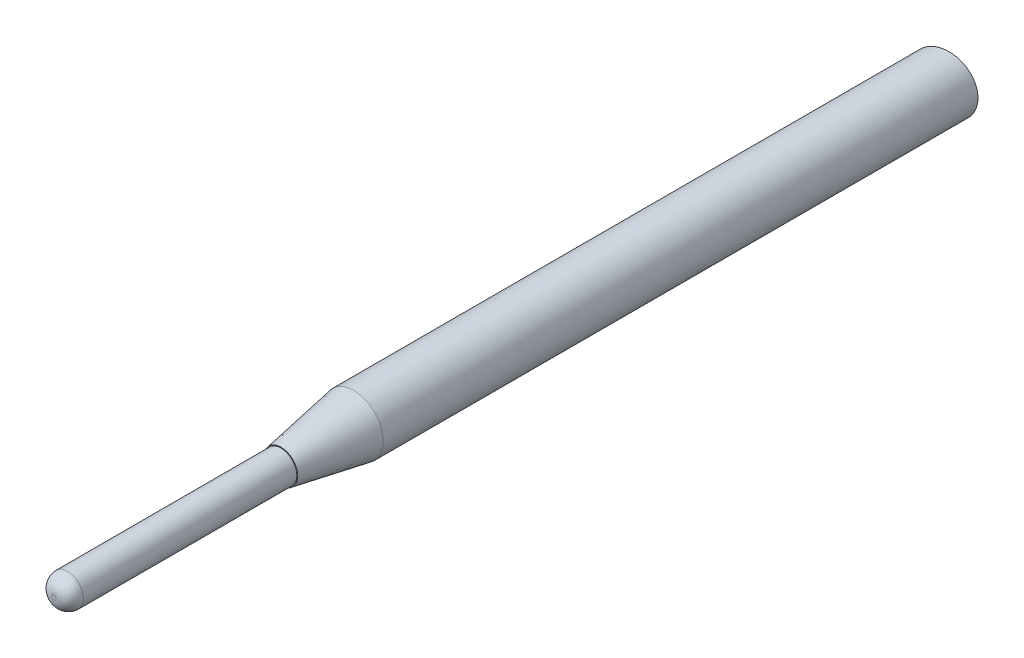
ISO-10303-21;
HEADER;
FILE_DESCRIPTION(('STEP AP214'),'2;1');
FILE_NAME('part.step','',(''),(''),'','','');
FILE_SCHEMA(('AUTOMOTIVE_DESIGN { 1 0 10303 214 1 1 1 1 }'));
ENDSEC;
DATA;
#1=APPLICATION_CONTEXT('core data for automotive mechanical design processes');
#2=APPLICATION_PROTOCOL_DEFINITION('international standard','automotive_design',2000,#1);
#3=PRODUCT_CONTEXT('',#1,'mechanical');
#4=PRODUCT('Part','Part','',(#3));
#5=PRODUCT_RELATED_PRODUCT_CATEGORY('part','',(#4));
#6=PRODUCT_DEFINITION_FORMATION('','',#4);
#7=PRODUCT_DEFINITION_CONTEXT('part definition',#1,'design');
#8=PRODUCT_DEFINITION('design','',#6,#7);
#9=PRODUCT_DEFINITION_SHAPE('','',#8);
#10=(LENGTH_UNIT() NAMED_UNIT(*) SI_UNIT(.MILLI.,.METRE.));
#11=(NAMED_UNIT(*) PLANE_ANGLE_UNIT() SI_UNIT($,.RADIAN.));
#12=(NAMED_UNIT(*) SI_UNIT($,.STERADIAN.) SOLID_ANGLE_UNIT());
#13=UNCERTAINTY_MEASURE_WITH_UNIT(LENGTH_MEASURE(1.E-05),#10,'distance_accuracy_value','');
#14=(GEOMETRIC_REPRESENTATION_CONTEXT(3) GLOBAL_UNCERTAINTY_ASSIGNED_CONTEXT((#13)) GLOBAL_UNIT_ASSIGNED_CONTEXT((#10,
#11,#12)) REPRESENTATION_CONTEXT('',''));
#15=CARTESIAN_POINT('',(0.,0.,0.));
#16=DIRECTION('',(0.,0.,1.));
#17=DIRECTION('',(1.,0.,0.));
#18=AXIS2_PLACEMENT_3D('',#15,#16,#17);
#19=CARTESIAN_POINT('',(0.,0.,147.));
#20=DIRECTION('',(0.,0.,-1.));
#21=DIRECTION('',(-1.,0.,0.));
#22=AXIS2_PLACEMENT_3D('',#19,#20,#21);
#23=CYLINDRICAL_SURFACE('',#22,6.5);
#24=CARTESIAN_POINT('',(0.,0.,131.));
#25=DIRECTION('',(0.,0.,1.));
#26=DIRECTION('',(1.,0.,0.));
#27=AXIS2_PLACEMENT_3D('',#24,#25,#26);
#28=CIRCLE('',#27,6.5);
#29=CARTESIAN_POINT('',(6.5,0.,131.));
#30=VERTEX_POINT('',#29);
#31=EDGE_CURVE('E11',#30,#30,#28,.F.);
#32=ORIENTED_EDGE('',*,*,#31,.T.);
#33=EDGE_LOOP('',(#32));
#34=FACE_BOUND('',#33,.T.);
#35=CARTESIAN_POINT('',(0.,0.,0.913515425565503));
#36=DIRECTION('',(0.139173100960059,0.,0.990268068741571));
#37=DIRECTION('',(0.990268068741571,0.,-0.139173100960059));
#38=AXIS2_PLACEMENT_3D('',#35,#36,#37);
#39=ELLIPSE('',#38,6.56387922137101,6.5);
#40=CARTESIAN_POINT('',(6.5,0.,0.));
#41=VERTEX_POINT('',#40);
#42=EDGE_CURVE('E68',#41,#41,#39,.T.);
#43=ORIENTED_EDGE('',*,*,#42,.T.);
#44=EDGE_LOOP('',(#43));
#45=FACE_BOUND('',#44,.T.);
#46=ADVANCED_FACE('F37',(#34,#45),#23,.T.);
#47=CARTESIAN_POINT('',(0.,0.,147.));
#48=DIRECTION('',(0.,0.,1.));
#49=DIRECTION('',(1.,0.,0.));
#50=AXIS2_PLACEMENT_3D('',#47,#48,#49);
#51=PLANE('',#50);
#52=CARTESIAN_POINT('',(0.,0.,147.));
#53=DIRECTION('',(0.,0.,1.));
#54=DIRECTION('',(1.,0.,0.));
#55=AXIS2_PLACEMENT_3D('',#52,#53,#54);
#56=CIRCLE('',#55,3.67876830866459);
#57=CARTESIAN_POINT('',(3.67876830866459,0.,147.));
#58=VERTEX_POINT('',#57);
#59=EDGE_CURVE('E45',#58,#58,#56,.T.);
#60=ORIENTED_EDGE('',*,*,#59,.T.);
#61=EDGE_LOOP('',(#60));
#62=FACE_BOUND('',#61,.T.);
#63=CARTESIAN_POINT('',(0.,0.,147.));
#64=DIRECTION('',(0.,0.,1.));
#65=DIRECTION('',(1.,0.,0.));
#66=AXIS2_PLACEMENT_3D('',#63,#64,#65);
#67=CIRCLE('',#66,3.5);
#68=CARTESIAN_POINT('',(3.5,0.,147.));
#69=VERTEX_POINT('',#68);
#70=EDGE_CURVE('E86',#69,#69,#67,.T.);
#71=ORIENTED_EDGE('',*,*,#70,.F.);
#72=EDGE_LOOP('',(#71));
#73=FACE_BOUND('',#72,.T.);
#74=ADVANCED_FACE('F97',(#62,#73),#51,.T.);
#75=CARTESIAN_POINT('',(0.,0.,197.));
#76=DIRECTION('',(0.,0.,-1.));
#77=DIRECTION('',(-1.,0.,0.));
#78=AXIS2_PLACEMENT_3D('',#75,#76,#77);
#79=CYLINDRICAL_SURFACE('',#78,3.5);
#80=CARTESIAN_POINT('',(0.,0.,194.));
#81=DIRECTION('',(0.,0.,1.));
#82=DIRECTION('',(1.,0.,0.));
#83=AXIS2_PLACEMENT_3D('',#80,#81,#82);
#84=CIRCLE('',#83,3.5);
#85=CARTESIAN_POINT('',(3.5,0.,194.));
#86=VERTEX_POINT('',#85);
#87=EDGE_CURVE('E92',#86,#86,#84,.F.);
#88=ORIENTED_EDGE('',*,*,#87,.T.);
#89=EDGE_LOOP('',(#88));
#90=FACE_BOUND('',#89,.T.);
#91=ORIENTED_EDGE('',*,*,#70,.T.);
#92=EDGE_LOOP('',(#91));
#93=FACE_BOUND('',#92,.T.);
#94=ADVANCED_FACE('F117',(#90,#93),#79,.T.);
#95=CARTESIAN_POINT('',(0.,0.,197.));
#96=DIRECTION('',(0.,0.,1.));
#97=DIRECTION('',(1.,0.,0.));
#98=AXIS2_PLACEMENT_3D('',#95,#96,#97);
#99=PLANE('',#98);
#100=CARTESIAN_POINT('',(0.,0.,197.));
#101=DIRECTION('',(0.,0.,1.));
#102=DIRECTION('',(1.,0.,0.));
#103=AXIS2_PLACEMENT_3D('',#100,#101,#102);
#104=CIRCLE('',#103,0.5);
#105=CARTESIAN_POINT('',(0.5,0.,197.));
#106=VERTEX_POINT('',#105);
#107=EDGE_CURVE('E89',#106,#106,#104,.T.);
#108=ORIENTED_EDGE('',*,*,#107,.T.);
#109=EDGE_LOOP('',(#108));
#110=FACE_BOUND('',#109,.T.);
#111=ADVANCED_FACE('F108',(#110),#99,.T.);
#112=CARTESIAN_POINT('',(0.,0.,194.));
#113=DIRECTION('',(0.,0.,1.));
#114=DIRECTION('',(1.,0.,0.));
#115=AXIS2_PLACEMENT_3D('',#112,#113,#114);
#116=DEGENERATE_TOROIDAL_SURFACE('',#115,0.5,3.,.T.);
#117=ORIENTED_EDGE('',*,*,#87,.F.);
#118=EDGE_LOOP('',(#117));
#119=FACE_BOUND('',#118,.T.);
#120=ORIENTED_EDGE('',*,*,#107,.F.);
#121=EDGE_LOOP('',(#120));
#122=FACE_BOUND('',#121,.T.);
#123=ADVANCED_FACE('F101',(#119,#122),#116,.T.);
#124=CARTESIAN_POINT('',(0.,0.,147.));
#125=DIRECTION('',(0.,0.,-1.));
#126=DIRECTION('',(-1.,0.,0.));
#127=AXIS2_PLACEMENT_3D('',#124,#125,#126);
#128=CONICAL_SURFACE('',#127,3.67876830866459,0.17453292519943);
#129=ORIENTED_EDGE('',*,*,#31,.F.);
#130=EDGE_LOOP('',(#129));
#131=FACE_BOUND('',#130,.T.);
#132=ORIENTED_EDGE('',*,*,#59,.F.);
#133=EDGE_LOOP('',(#132));
#134=FACE_BOUND('',#133,.T.);
#135=ADVANCED_FACE('F39',(#131,#134),#128,.T.);
#136=CARTESIAN_POINT('',(6.5,-6.5,0.));
#137=DIRECTION('',(0.139173100960059,0.,0.990268068741571));
#138=DIRECTION('',(0.990268068741571,0.,-0.139173100960059));
#139=AXIS2_PLACEMENT_3D('',#136,#137,#138);
#140=PLANE('',#139);
#141=DIRECTION('',(0.,-1.,0.));
#142=VECTOR('',#141,1.);
#143=CARTESIAN_POINT('',(1.71783744694811,1.18982242293795,0.6720891168884));
#144=LINE('',#143,#142);
#145=CARTESIAN_POINT('',(1.71783744694811,1.18982242293795,0.672089116888399));
#146=VERTEX_POINT('',#145);
#147=CARTESIAN_POINT('',(1.71783744694811,-1.18982242293795,0.6720891168884));
#148=VERTEX_POINT('',#147);
#149=EDGE_CURVE('E72',#146,#148,#144,.T.);
#150=ORIENTED_EDGE('',*,*,#149,.F.);
#151=CARTESIAN_POINT('',(0.125899488200451,0.,0.895821406405205));
#152=DIRECTION('',(-0.139173100960059,0.,-0.990268068741571));
#153=DIRECTION('',(-0.990268068741571,0.,0.139173100960059));
#154=AXIS2_PLACEMENT_3D('',#151,#152,#153);
#155=CIRCLE('',#154,2.);
#156=EDGE_CURVE('E52',#148,#146,#155,.T.);
#157=ORIENTED_EDGE('',*,*,#156,.F.);
#158=EDGE_LOOP('',(#150,#157));
#159=FACE_BOUND('',#158,.T.);
#160=ORIENTED_EDGE('',*,*,#42,.F.);
#161=EDGE_LOOP('',(#160));
#162=FACE_BOUND('',#161,.T.);
#163=ADVANCED_FACE('F76',(#159,#162),#140,.F.);
#164=CARTESIAN_POINT('',(0.821764993000745,0.,5.84716175011306));
#165=DIRECTION('',(-0.139173100960059,0.,-0.990268068741571));
#166=DIRECTION('',(-0.990268068741571,0.,0.139173100960059));
#167=AXIS2_PLACEMENT_3D('',#164,#165,#166);
#168=CYLINDRICAL_SURFACE('',#167,2.);
#169=ORIENTED_EDGE('',*,*,#156,.T.);
#170=DIRECTION('',(-0.139173100960059,0.,-0.990268068741571));
#171=VECTOR('',#170,1.);
#172=CARTESIAN_POINT('',(2.4137029517484,1.18982242293795,5.62342946059626));
#173=LINE('',#172,#171);
#174=CARTESIAN_POINT('',(2.4137029517484,1.18982242293795,5.62342946059626));
#175=VERTEX_POINT('',#174);
#176=EDGE_CURVE('E69',#175,#146,#173,.T.);
#177=ORIENTED_EDGE('',*,*,#176,.F.);
#178=CARTESIAN_POINT('',(0.821764993000745,0.,5.84716175011306));
#179=DIRECTION('',(-0.139173100960059,0.,-0.990268068741571));
#180=DIRECTION('',(-0.990268068741571,0.,0.139173100960059));
#181=AXIS2_PLACEMENT_3D('',#178,#179,#180);
#182=CIRCLE('',#181,2.);
#183=CARTESIAN_POINT('',(2.4137029517484,-1.18982242293795,5.62342946059626));
#184=VERTEX_POINT('',#183);
#185=EDGE_CURVE('E66',#184,#175,#182,.T.);
#186=ORIENTED_EDGE('',*,*,#185,.F.);
#187=DIRECTION('',(-0.139173100960059,0.,-0.990268068741571));
#188=VECTOR('',#187,1.);
#189=CARTESIAN_POINT('',(2.4137029517484,-1.18982242293795,5.62342946059626));
#190=LINE('',#189,#188);
#191=EDGE_CURVE('E60',#184,#148,#190,.T.);
#192=ORIENTED_EDGE('',*,*,#191,.T.);
#193=EDGE_LOOP('',(#169,#177,#186,#192));
#194=FACE_BOUND('',#193,.T.);
#195=ADVANCED_FACE('F64',(#194),#168,.F.);
#196=CARTESIAN_POINT('',(2.4137029517484,1.18982242293795,5.62342946059626));
#197=DIRECTION('',(0.990268068741571,0.,-0.139173100960059));
#198=DIRECTION('',(-0.139173100960059,0.,-0.990268068741571));
#199=AXIS2_PLACEMENT_3D('',#196,#197,#198);
#200=PLANE('',#199);
#201=ORIENTED_EDGE('',*,*,#149,.T.);
#202=ORIENTED_EDGE('',*,*,#191,.F.);
#203=DIRECTION('',(0.,-1.,0.));
#204=VECTOR('',#203,1.);
#205=CARTESIAN_POINT('',(2.4137029517484,1.18982242293795,5.62342946059626));
#206=LINE('',#205,#204);
#207=EDGE_CURVE('E80',#175,#184,#206,.T.);
#208=ORIENTED_EDGE('',*,*,#207,.F.);
#209=ORIENTED_EDGE('',*,*,#176,.T.);
#210=EDGE_LOOP('',(#201,#202,#208,#209));
#211=FACE_BOUND('',#210,.T.);
#212=ADVANCED_FACE('F73',(#211),#200,.F.);
#213=CARTESIAN_POINT('',(0.821764993000745,0.,5.84716175011306));
#214=DIRECTION('',(-0.139173100960059,0.,-0.990268068741571));
#215=DIRECTION('',(-0.990268068741571,0.,0.139173100960059));
#216=AXIS2_PLACEMENT_3D('',#213,#214,#215);
#217=PLANE('',#216);
#218=ORIENTED_EDGE('',*,*,#185,.T.);
#219=ORIENTED_EDGE('',*,*,#207,.T.);
#220=EDGE_LOOP('',(#218,#219));
#221=FACE_BOUND('',#220,.T.);
#222=ADVANCED_FACE('F131',(#221),#217,.T.);
#223=CLOSED_SHELL('',(#46,#74,#94,#111,#123,#135,#163,#195,#212,#222));
#224=MANIFOLD_SOLID_BREP('B2',#223);
#225=ADVANCED_BREP_SHAPE_REPRESENTATION('',(#18,#224),#14);
#226=SHAPE_DEFINITION_REPRESENTATION(#9,#225);
ENDSEC;
END-ISO-10303-21;
